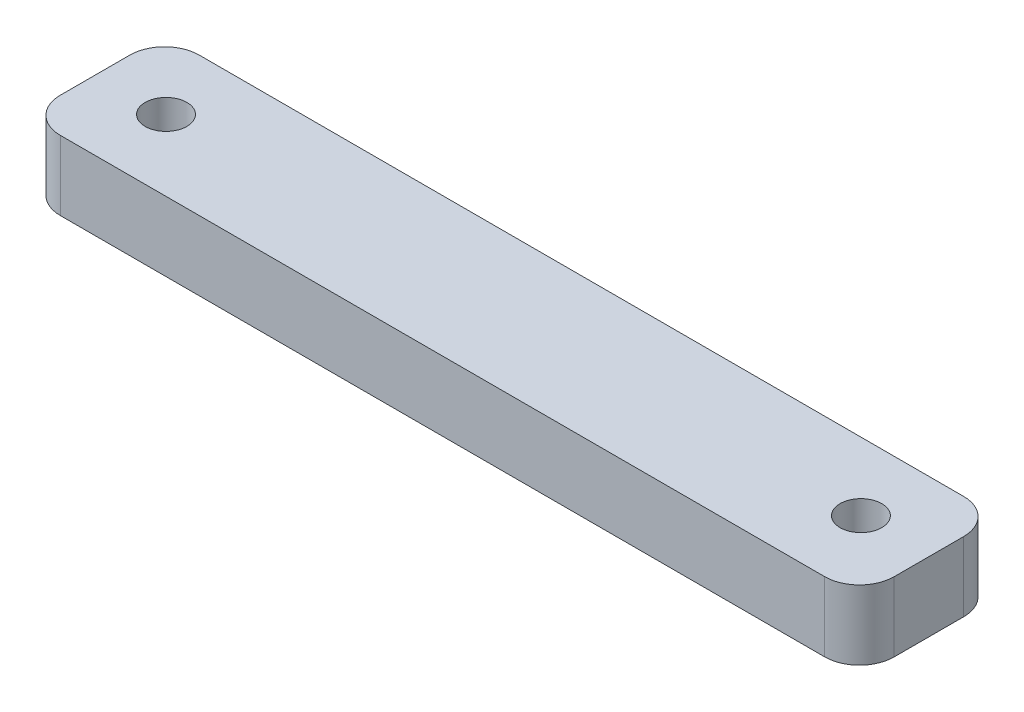
ISO-10303-21;
HEADER;
FILE_DESCRIPTION(('STEP AP214'),'2;1');
FILE_NAME('part.step','',(''),(''),'','','');
FILE_SCHEMA(('AUTOMOTIVE_DESIGN { 1 0 10303 214 1 1 1 1 }'));
ENDSEC;
DATA;
#1=APPLICATION_CONTEXT('core data for automotive mechanical design processes');
#2=APPLICATION_PROTOCOL_DEFINITION('international standard','automotive_design',2000,#1);
#3=PRODUCT_CONTEXT('',#1,'mechanical');
#4=PRODUCT('Part','Part','',(#3));
#5=PRODUCT_RELATED_PRODUCT_CATEGORY('part','',(#4));
#6=PRODUCT_DEFINITION_FORMATION('','',#4);
#7=PRODUCT_DEFINITION_CONTEXT('part definition',#1,'design');
#8=PRODUCT_DEFINITION('design','',#6,#7);
#9=PRODUCT_DEFINITION_SHAPE('','',#8);
#10=(LENGTH_UNIT() NAMED_UNIT(*) SI_UNIT(.MILLI.,.METRE.));
#11=(NAMED_UNIT(*) PLANE_ANGLE_UNIT() SI_UNIT($,.RADIAN.));
#12=(NAMED_UNIT(*) SI_UNIT($,.STERADIAN.) SOLID_ANGLE_UNIT());
#13=UNCERTAINTY_MEASURE_WITH_UNIT(LENGTH_MEASURE(1.E-05),#10,'distance_accuracy_value','');
#14=(GEOMETRIC_REPRESENTATION_CONTEXT(3) GLOBAL_UNCERTAINTY_ASSIGNED_CONTEXT((#13)) GLOBAL_UNIT_ASSIGNED_CONTEXT((#10,
#11,#12)) REPRESENTATION_CONTEXT('',''));
#15=CARTESIAN_POINT('',(0.,0.,0.));
#16=DIRECTION('',(0.,0.,1.));
#17=DIRECTION('',(1.,0.,0.));
#18=AXIS2_PLACEMENT_3D('',#15,#16,#17);
#19=CARTESIAN_POINT('',(146.05,12.7,-6.35));
#20=DIRECTION('',(0.,-1.,0.));
#21=DIRECTION('',(0.,0.,-1.));
#22=AXIS2_PLACEMENT_3D('',#19,#20,#21);
#23=PLANE('',#22);
#24=CARTESIAN_POINT('',(12.7,12.7,-12.9687634913736));
#25=DIRECTION('',(0.,1.,0.));
#26=DIRECTION('',(0.,0.,1.));
#27=AXIS2_PLACEMENT_3D('',#24,#25,#26);
#28=CIRCLE('',#27,3.81);
#29=CARTESIAN_POINT('',(12.7,12.7,-9.1587634913736));
#30=VERTEX_POINT('',#29);
#31=EDGE_CURVE('E133',#30,#30,#28,.T.);
#32=ORIENTED_EDGE('',*,*,#31,.F.);
#33=EDGE_LOOP('',(#32));
#34=FACE_BOUND('',#33,.T.);
#35=CARTESIAN_POINT('',(146.05,12.7,-6.35));
#36=DIRECTION('',(0.,1.,0.));
#37=DIRECTION('',(0.,0.,-1.));
#38=AXIS2_PLACEMENT_3D('',#35,#36,#37);
#39=CIRCLE('',#38,6.35);
#40=CARTESIAN_POINT('',(146.05,12.7,0.));
#41=VERTEX_POINT('',#40);
#42=CARTESIAN_POINT('',(152.4,12.7,-6.35));
#43=VERTEX_POINT('',#42);
#44=EDGE_CURVE('E144',#41,#43,#39,.T.);
#45=ORIENTED_EDGE('',*,*,#44,.T.);
#46=DIRECTION('',(0.,0.,-1.));
#47=VECTOR('',#46,1.);
#48=CARTESIAN_POINT('',(152.4,12.7,-6.35));
#49=LINE('',#48,#47);
#50=CARTESIAN_POINT('',(152.4,12.7,-19.05));
#51=VERTEX_POINT('',#50);
#52=EDGE_CURVE('E92',#43,#51,#49,.T.);
#53=ORIENTED_EDGE('',*,*,#52,.T.);
#54=CARTESIAN_POINT('',(146.05,12.7,-19.05));
#55=DIRECTION('',(0.,1.,0.));
#56=DIRECTION('',(0.,0.,1.));
#57=AXIS2_PLACEMENT_3D('',#54,#55,#56);
#58=CIRCLE('',#57,6.34999999999998);
#59=CARTESIAN_POINT('',(146.05,12.7,-25.4));
#60=VERTEX_POINT('',#59);
#61=EDGE_CURVE('E159',#51,#60,#58,.T.);
#62=ORIENTED_EDGE('',*,*,#61,.T.);
#63=DIRECTION('',(-1.,0.,0.));
#64=VECTOR('',#63,1.);
#65=CARTESIAN_POINT('',(6.35000000000004,12.7,-25.4));
#66=LINE('',#65,#64);
#67=CARTESIAN_POINT('',(6.35000000000004,12.7,-25.4));
#68=VERTEX_POINT('',#67);
#69=EDGE_CURVE('E172',#60,#68,#66,.T.);
#70=ORIENTED_EDGE('',*,*,#69,.T.);
#71=CARTESIAN_POINT('',(6.35,12.7,-19.05));
#72=DIRECTION('',(0.,1.,0.));
#73=DIRECTION('',(0.,0.,-1.));
#74=AXIS2_PLACEMENT_3D('',#71,#72,#73);
#75=CIRCLE('',#74,6.35);
#76=CARTESIAN_POINT('',(0.,12.7,-19.05));
#77=VERTEX_POINT('',#76);
#78=EDGE_CURVE('E111',#68,#77,#75,.T.);
#79=ORIENTED_EDGE('',*,*,#78,.T.);
#80=DIRECTION('',(0.,0.,1.));
#81=VECTOR('',#80,1.);
#82=CARTESIAN_POINT('',(0.,12.7,-6.35000000000004));
#83=LINE('',#82,#81);
#84=CARTESIAN_POINT('',(0.,12.7,-6.35000000000004));
#85=VERTEX_POINT('',#84);
#86=EDGE_CURVE('E105',#77,#85,#83,.T.);
#87=ORIENTED_EDGE('',*,*,#86,.T.);
#88=CARTESIAN_POINT('',(6.35,12.7,-6.35));
#89=DIRECTION('',(0.,1.,0.));
#90=DIRECTION('',(0.,0.,-1.));
#91=AXIS2_PLACEMENT_3D('',#88,#89,#90);
#92=CIRCLE('',#91,6.35);
#93=CARTESIAN_POINT('',(6.35000000000005,12.7,0.));
#94=VERTEX_POINT('',#93);
#95=EDGE_CURVE('E109',#85,#94,#92,.T.);
#96=ORIENTED_EDGE('',*,*,#95,.T.);
#97=DIRECTION('',(1.,0.,0.));
#98=VECTOR('',#97,1.);
#99=CARTESIAN_POINT('',(6.35000000000004,12.7,0.));
#100=LINE('',#99,#98);
#101=EDGE_CURVE('E49',#94,#41,#100,.T.);
#102=ORIENTED_EDGE('',*,*,#101,.T.);
#103=EDGE_LOOP('',(#45,#53,#62,#70,#79,#87,#96,#102));
#104=FACE_BOUND('',#103,.T.);
#105=CARTESIAN_POINT('',(139.7,12.7,-12.9687634913736));
#106=DIRECTION('',(0.,1.,0.));
#107=DIRECTION('',(0.,0.,1.));
#108=AXIS2_PLACEMENT_3D('',#105,#106,#107);
#109=CIRCLE('',#108,3.81000000000001);
#110=CARTESIAN_POINT('',(139.7,12.7,-9.15876349137359));
#111=VERTEX_POINT('',#110);
#112=EDGE_CURVE('E181',#111,#111,#109,.T.);
#113=ORIENTED_EDGE('',*,*,#112,.F.);
#114=EDGE_LOOP('',(#113));
#115=FACE_BOUND('',#114,.T.);
#116=ADVANCED_FACE('F32',(#34,#104,#115),#23,.F.);
#117=CARTESIAN_POINT('',(146.05,0.,-6.35));
#118=DIRECTION('',(0.,-1.,0.));
#119=DIRECTION('',(0.,0.,-1.));
#120=AXIS2_PLACEMENT_3D('',#117,#118,#119);
#121=PLANE('',#120);
#122=CARTESIAN_POINT('',(12.7,0.,-12.9687634913736));
#123=DIRECTION('',(0.,1.,0.));
#124=DIRECTION('',(0.,0.,1.));
#125=AXIS2_PLACEMENT_3D('',#122,#123,#124);
#126=CIRCLE('',#125,3.81);
#127=CARTESIAN_POINT('',(12.7,0.,-9.1587634913736));
#128=VERTEX_POINT('',#127);
#129=EDGE_CURVE('E178',#128,#128,#126,.T.);
#130=ORIENTED_EDGE('',*,*,#129,.T.);
#131=EDGE_LOOP('',(#130));
#132=FACE_BOUND('',#131,.T.);
#133=CARTESIAN_POINT('',(146.05,0.,-6.35));
#134=DIRECTION('',(0.,1.,0.));
#135=DIRECTION('',(0.,0.,-1.));
#136=AXIS2_PLACEMENT_3D('',#133,#134,#135);
#137=CIRCLE('',#136,6.35);
#138=CARTESIAN_POINT('',(146.05,0.,0.));
#139=VERTEX_POINT('',#138);
#140=CARTESIAN_POINT('',(152.4,0.,-6.35));
#141=VERTEX_POINT('',#140);
#142=EDGE_CURVE('E129',#139,#141,#137,.T.);
#143=ORIENTED_EDGE('',*,*,#142,.F.);
#144=DIRECTION('',(1.,0.,0.));
#145=VECTOR('',#144,1.);
#146=CARTESIAN_POINT('',(6.35000000000004,0.,0.));
#147=LINE('',#146,#145);
#148=CARTESIAN_POINT('',(6.35000000000005,0.,0.));
#149=VERTEX_POINT('',#148);
#150=EDGE_CURVE('E84',#149,#139,#147,.T.);
#151=ORIENTED_EDGE('',*,*,#150,.F.);
#152=CARTESIAN_POINT('',(6.35,0.,-6.35));
#153=DIRECTION('',(0.,1.,0.));
#154=DIRECTION('',(0.,0.,-1.));
#155=AXIS2_PLACEMENT_3D('',#152,#153,#154);
#156=CIRCLE('',#155,6.35);
#157=CARTESIAN_POINT('',(0.,0.,-6.35000000000004));
#158=VERTEX_POINT('',#157);
#159=EDGE_CURVE('E78',#158,#149,#156,.T.);
#160=ORIENTED_EDGE('',*,*,#159,.F.);
#161=DIRECTION('',(0.,0.,1.));
#162=VECTOR('',#161,1.);
#163=CARTESIAN_POINT('',(0.,0.,-6.35000000000004));
#164=LINE('',#163,#162);
#165=CARTESIAN_POINT('',(0.,0.,-19.05));
#166=VERTEX_POINT('',#165);
#167=EDGE_CURVE('E119',#166,#158,#164,.T.);
#168=ORIENTED_EDGE('',*,*,#167,.F.);
#169=CARTESIAN_POINT('',(6.35,0.,-19.05));
#170=DIRECTION('',(0.,1.,0.));
#171=DIRECTION('',(0.,0.,-1.));
#172=AXIS2_PLACEMENT_3D('',#169,#170,#171);
#173=CIRCLE('',#172,6.35);
#174=CARTESIAN_POINT('',(6.35000000000004,0.,-25.4));
#175=VERTEX_POINT('',#174);
#176=EDGE_CURVE('E139',#175,#166,#173,.T.);
#177=ORIENTED_EDGE('',*,*,#176,.F.);
#178=DIRECTION('',(-1.,0.,0.));
#179=VECTOR('',#178,1.);
#180=CARTESIAN_POINT('',(6.35000000000004,0.,-25.4));
#181=LINE('',#180,#179);
#182=CARTESIAN_POINT('',(146.05,0.,-25.4));
#183=VERTEX_POINT('',#182);
#184=EDGE_CURVE('E137',#183,#175,#181,.T.);
#185=ORIENTED_EDGE('',*,*,#184,.F.);
#186=CARTESIAN_POINT('',(146.05,0.,-19.05));
#187=DIRECTION('',(0.,1.,0.));
#188=DIRECTION('',(0.,0.,1.));
#189=AXIS2_PLACEMENT_3D('',#186,#187,#188);
#190=CIRCLE('',#189,6.34999999999998);
#191=CARTESIAN_POINT('',(152.4,0.,-19.05));
#192=VERTEX_POINT('',#191);
#193=EDGE_CURVE('E135',#192,#183,#190,.T.);
#194=ORIENTED_EDGE('',*,*,#193,.F.);
#195=DIRECTION('',(0.,0.,-1.));
#196=VECTOR('',#195,1.);
#197=CARTESIAN_POINT('',(152.4,0.,-6.35));
#198=LINE('',#197,#196);
#199=EDGE_CURVE('E132',#141,#192,#198,.T.);
#200=ORIENTED_EDGE('',*,*,#199,.F.);
#201=EDGE_LOOP('',(#143,#151,#160,#168,#177,#185,#194,#200));
#202=FACE_BOUND('',#201,.T.);
#203=CARTESIAN_POINT('',(139.7,0.,-12.9687634913736));
#204=DIRECTION('',(0.,1.,0.));
#205=DIRECTION('',(0.,0.,1.));
#206=AXIS2_PLACEMENT_3D('',#203,#204,#205);
#207=CIRCLE('',#206,3.81000000000001);
#208=CARTESIAN_POINT('',(139.7,0.,-9.15876349137359));
#209=VERTEX_POINT('',#208);
#210=EDGE_CURVE('E184',#209,#209,#207,.T.);
#211=ORIENTED_EDGE('',*,*,#210,.T.);
#212=EDGE_LOOP('',(#211));
#213=FACE_BOUND('',#212,.T.);
#214=ADVANCED_FACE('F163',(#132,#202,#213),#121,.T.);
#215=CARTESIAN_POINT('',(146.05,12.7,-6.35));
#216=DIRECTION('',(0.,-1.,0.));
#217=DIRECTION('',(0.,0.,-1.));
#218=AXIS2_PLACEMENT_3D('',#215,#216,#217);
#219=CYLINDRICAL_SURFACE('',#218,6.35);
#220=ORIENTED_EDGE('',*,*,#142,.T.);
#221=DIRECTION('',(0.,-1.,0.));
#222=VECTOR('',#221,1.);
#223=CARTESIAN_POINT('',(152.4,12.7,-6.35));
#224=LINE('',#223,#222);
#225=EDGE_CURVE('E11',#43,#141,#224,.T.);
#226=ORIENTED_EDGE('',*,*,#225,.F.);
#227=ORIENTED_EDGE('',*,*,#44,.F.);
#228=DIRECTION('',(0.,-1.,0.));
#229=VECTOR('',#228,1.);
#230=CARTESIAN_POINT('',(146.05,12.7,0.));
#231=LINE('',#230,#229);
#232=EDGE_CURVE('E125',#41,#139,#231,.T.);
#233=ORIENTED_EDGE('',*,*,#232,.T.);
#234=EDGE_LOOP('',(#220,#226,#227,#233));
#235=FACE_BOUND('',#234,.T.);
#236=ADVANCED_FACE('F34',(#235),#219,.T.);
#237=CARTESIAN_POINT('',(152.4,12.7,-6.35));
#238=DIRECTION('',(-1.,0.,0.));
#239=DIRECTION('',(0.,0.,1.));
#240=AXIS2_PLACEMENT_3D('',#237,#238,#239);
#241=PLANE('',#240);
#242=ORIENTED_EDGE('',*,*,#199,.T.);
#243=DIRECTION('',(0.,-1.,0.));
#244=VECTOR('',#243,1.);
#245=CARTESIAN_POINT('',(152.4,12.7,-19.05));
#246=LINE('',#245,#244);
#247=EDGE_CURVE('E41',#51,#192,#246,.T.);
#248=ORIENTED_EDGE('',*,*,#247,.F.);
#249=ORIENTED_EDGE('',*,*,#52,.F.);
#250=ORIENTED_EDGE('',*,*,#225,.T.);
#251=EDGE_LOOP('',(#242,#248,#249,#250));
#252=FACE_BOUND('',#251,.T.);
#253=ADVANCED_FACE('F217',(#252),#241,.F.);
#254=CARTESIAN_POINT('',(146.05,12.7,-19.05));
#255=DIRECTION('',(0.,-1.,0.));
#256=DIRECTION('',(0.,0.,-1.));
#257=AXIS2_PLACEMENT_3D('',#254,#255,#256);
#258=CYLINDRICAL_SURFACE('',#257,6.34999999999998);
#259=ORIENTED_EDGE('',*,*,#193,.T.);
#260=DIRECTION('',(0.,-1.,0.));
#261=VECTOR('',#260,1.);
#262=CARTESIAN_POINT('',(146.05,12.7,-25.4));
#263=LINE('',#262,#261);
#264=EDGE_CURVE('E151',#60,#183,#263,.T.);
#265=ORIENTED_EDGE('',*,*,#264,.F.);
#266=ORIENTED_EDGE('',*,*,#61,.F.);
#267=ORIENTED_EDGE('',*,*,#247,.T.);
#268=EDGE_LOOP('',(#259,#265,#266,#267));
#269=FACE_BOUND('',#268,.T.);
#270=ADVANCED_FACE('F157',(#269),#258,.T.);
#271=CARTESIAN_POINT('',(6.35000000000004,12.7,-25.4));
#272=DIRECTION('',(0.,0.,1.));
#273=DIRECTION('',(1.,0.,0.));
#274=AXIS2_PLACEMENT_3D('',#271,#272,#273);
#275=PLANE('',#274);
#276=ORIENTED_EDGE('',*,*,#184,.T.);
#277=DIRECTION('',(0.,-1.,0.));
#278=VECTOR('',#277,1.);
#279=CARTESIAN_POINT('',(6.35000000000004,12.7,-25.4));
#280=LINE('',#279,#278);
#281=EDGE_CURVE('E148',#68,#175,#280,.T.);
#282=ORIENTED_EDGE('',*,*,#281,.F.);
#283=ORIENTED_EDGE('',*,*,#69,.F.);
#284=ORIENTED_EDGE('',*,*,#264,.T.);
#285=EDGE_LOOP('',(#276,#282,#283,#284));
#286=FACE_BOUND('',#285,.T.);
#287=ADVANCED_FACE('F168',(#286),#275,.F.);
#288=CARTESIAN_POINT('',(6.35,12.7,-19.05));
#289=DIRECTION('',(0.,-1.,0.));
#290=DIRECTION('',(0.,0.,-1.));
#291=AXIS2_PLACEMENT_3D('',#288,#289,#290);
#292=CYLINDRICAL_SURFACE('',#291,6.35);
#293=ORIENTED_EDGE('',*,*,#176,.T.);
#294=DIRECTION('',(0.,-1.,0.));
#295=VECTOR('',#294,1.);
#296=CARTESIAN_POINT('',(0.,12.7,-19.05));
#297=LINE('',#296,#295);
#298=EDGE_CURVE('E120',#77,#166,#297,.T.);
#299=ORIENTED_EDGE('',*,*,#298,.F.);
#300=ORIENTED_EDGE('',*,*,#78,.F.);
#301=ORIENTED_EDGE('',*,*,#281,.T.);
#302=EDGE_LOOP('',(#293,#299,#300,#301));
#303=FACE_BOUND('',#302,.T.);
#304=ADVANCED_FACE('F171',(#303),#292,.T.);
#305=CARTESIAN_POINT('',(0.,12.7,-6.35000000000004));
#306=DIRECTION('',(1.,0.,0.));
#307=DIRECTION('',(0.,0.,-1.));
#308=AXIS2_PLACEMENT_3D('',#305,#306,#307);
#309=PLANE('',#308);
#310=ORIENTED_EDGE('',*,*,#167,.T.);
#311=DIRECTION('',(0.,-1.,0.));
#312=VECTOR('',#311,1.);
#313=CARTESIAN_POINT('',(0.,12.7,-6.35000000000004));
#314=LINE('',#313,#312);
#315=EDGE_CURVE('E116',#85,#158,#314,.T.);
#316=ORIENTED_EDGE('',*,*,#315,.F.);
#317=ORIENTED_EDGE('',*,*,#86,.F.);
#318=ORIENTED_EDGE('',*,*,#298,.T.);
#319=EDGE_LOOP('',(#310,#316,#317,#318));
#320=FACE_BOUND('',#319,.T.);
#321=ADVANCED_FACE('F117',(#320),#309,.F.);
#322=CARTESIAN_POINT('',(6.35,12.7,-6.35));
#323=DIRECTION('',(0.,-1.,0.));
#324=DIRECTION('',(0.,0.,-1.));
#325=AXIS2_PLACEMENT_3D('',#322,#323,#324);
#326=CYLINDRICAL_SURFACE('',#325,6.35);
#327=ORIENTED_EDGE('',*,*,#159,.T.);
#328=DIRECTION('',(0.,-1.,0.));
#329=VECTOR('',#328,1.);
#330=CARTESIAN_POINT('',(6.35000000000005,12.7,0.));
#331=LINE('',#330,#329);
#332=EDGE_CURVE('E121',#94,#149,#331,.T.);
#333=ORIENTED_EDGE('',*,*,#332,.F.);
#334=ORIENTED_EDGE('',*,*,#95,.F.);
#335=ORIENTED_EDGE('',*,*,#315,.T.);
#336=EDGE_LOOP('',(#327,#333,#334,#335));
#337=FACE_BOUND('',#336,.T.);
#338=ADVANCED_FACE('F123',(#337),#326,.T.);
#339=CARTESIAN_POINT('',(6.35000000000004,12.7,0.));
#340=DIRECTION('',(0.,0.,-1.));
#341=DIRECTION('',(-1.,0.,0.));
#342=AXIS2_PLACEMENT_3D('',#339,#340,#341);
#343=PLANE('',#342);
#344=ORIENTED_EDGE('',*,*,#150,.T.);
#345=ORIENTED_EDGE('',*,*,#232,.F.);
#346=ORIENTED_EDGE('',*,*,#101,.F.);
#347=ORIENTED_EDGE('',*,*,#332,.T.);
#348=EDGE_LOOP('',(#344,#345,#346,#347));
#349=FACE_BOUND('',#348,.T.);
#350=ADVANCED_FACE('F205',(#349),#343,.F.);
#351=CARTESIAN_POINT('',(12.7,12.7,-12.9687634913736));
#352=DIRECTION('',(0.,-1.,0.));
#353=DIRECTION('',(0.,0.,-1.));
#354=AXIS2_PLACEMENT_3D('',#351,#352,#353);
#355=CYLINDRICAL_SURFACE('',#354,3.81);
#356=ORIENTED_EDGE('',*,*,#31,.T.);
#357=EDGE_LOOP('',(#356));
#358=FACE_BOUND('',#357,.T.);
#359=ORIENTED_EDGE('',*,*,#129,.F.);
#360=EDGE_LOOP('',(#359));
#361=FACE_BOUND('',#360,.T.);
#362=ADVANCED_FACE('F202',(#358,#361),#355,.F.);
#363=CARTESIAN_POINT('',(139.7,12.7,-12.9687634913736));
#364=DIRECTION('',(0.,-1.,0.));
#365=DIRECTION('',(0.,0.,-1.));
#366=AXIS2_PLACEMENT_3D('',#363,#364,#365);
#367=CYLINDRICAL_SURFACE('',#366,3.81000000000001);
#368=ORIENTED_EDGE('',*,*,#112,.T.);
#369=EDGE_LOOP('',(#368));
#370=FACE_BOUND('',#369,.T.);
#371=ORIENTED_EDGE('',*,*,#210,.F.);
#372=EDGE_LOOP('',(#371));
#373=FACE_BOUND('',#372,.T.);
#374=ADVANCED_FACE('F190',(#370,#373),#367,.F.);
#375=CLOSED_SHELL('',(#116,#214,#236,#253,#270,#287,#304,#321,#338,#350,#362,#374));
#376=MANIFOLD_SOLID_BREP('B2',#375);
#377=ADVANCED_BREP_SHAPE_REPRESENTATION('',(#18,#376),#14);
#378=SHAPE_DEFINITION_REPRESENTATION(#9,#377);
ENDSEC;
END-ISO-10303-21;
